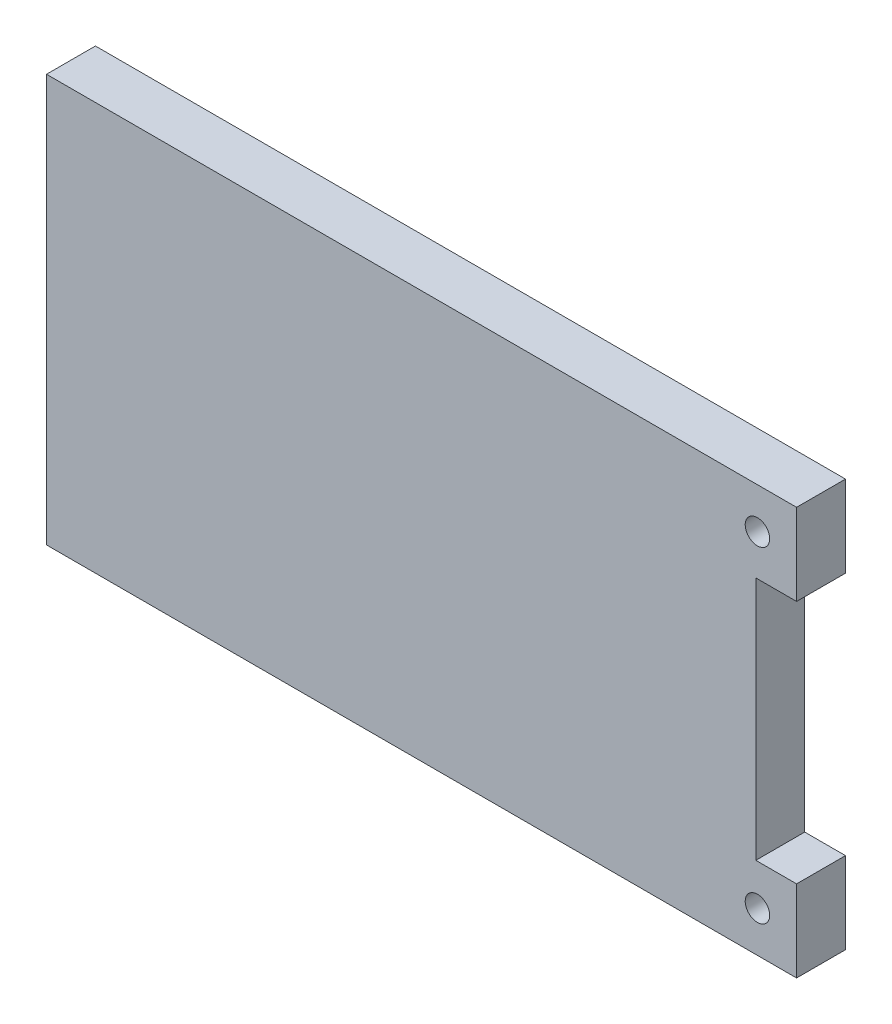
ISO-10303-21;
HEADER;
FILE_DESCRIPTION(('STEP AP214'),'2;1');
FILE_NAME('part.step','',(''),(''),'','','');
FILE_SCHEMA(('AUTOMOTIVE_DESIGN { 1 0 10303 214 1 1 1 1 }'));
ENDSEC;
DATA;
#1=APPLICATION_CONTEXT('core data for automotive mechanical design processes');
#2=APPLICATION_PROTOCOL_DEFINITION('international standard','automotive_design',2000,#1);
#3=PRODUCT_CONTEXT('',#1,'mechanical');
#4=PRODUCT('Part','Part','',(#3));
#5=PRODUCT_RELATED_PRODUCT_CATEGORY('part','',(#4));
#6=PRODUCT_DEFINITION_FORMATION('','',#4);
#7=PRODUCT_DEFINITION_CONTEXT('part definition',#1,'design');
#8=PRODUCT_DEFINITION('design','',#6,#7);
#9=PRODUCT_DEFINITION_SHAPE('','',#8);
#10=(LENGTH_UNIT() NAMED_UNIT(*) SI_UNIT(.MILLI.,.METRE.));
#11=(NAMED_UNIT(*) PLANE_ANGLE_UNIT() SI_UNIT($,.RADIAN.));
#12=(NAMED_UNIT(*) SI_UNIT($,.STERADIAN.) SOLID_ANGLE_UNIT());
#13=UNCERTAINTY_MEASURE_WITH_UNIT(LENGTH_MEASURE(1.E-05),#10,'distance_accuracy_value','');
#14=(GEOMETRIC_REPRESENTATION_CONTEXT(3) GLOBAL_UNCERTAINTY_ASSIGNED_CONTEXT((#13)) GLOBAL_UNIT_ASSIGNED_CONTEXT((#10,
#11,#12)) REPRESENTATION_CONTEXT('',''));
#15=CARTESIAN_POINT('',(0.,0.,0.));
#16=DIRECTION('',(0.,0.,1.));
#17=DIRECTION('',(1.,0.,0.));
#18=AXIS2_PLACEMENT_3D('',#15,#16,#17);
#19=CARTESIAN_POINT('',(0.,0.,0.6));
#20=DIRECTION('',(0.,0.,-1.));
#21=DIRECTION('',(-1.,0.,0.));
#22=AXIS2_PLACEMENT_3D('',#19,#20,#21);
#23=PLANE('',#22);
#24=DIRECTION('',(-1.,0.,0.));
#25=VECTOR('',#24,1.);
#26=CARTESIAN_POINT('',(139.15,52.1,0.6));
#27=LINE('',#26,#25);
#28=CARTESIAN_POINT('',(148.35,52.1,0.6));
#29=VERTEX_POINT('',#28);
#30=CARTESIAN_POINT('',(139.15,52.1,0.6));
#31=VERTEX_POINT('',#30);
#32=EDGE_CURVE('E148',#29,#31,#27,.T.);
#33=ORIENTED_EDGE('',*,*,#32,.T.);
#34=DIRECTION('',(0.,-1.,0.));
#35=VECTOR('',#34,1.);
#36=CARTESIAN_POINT('',(139.15,49.3,0.6));
#37=LINE('',#36,#35);
#38=CARTESIAN_POINT('',(139.15,47.1,0.6));
#39=VERTEX_POINT('',#38);
#40=EDGE_CURVE('E95',#31,#39,#37,.T.);
#41=ORIENTED_EDGE('',*,*,#40,.T.);
#42=DIRECTION('',(1.,0.,0.));
#43=VECTOR('',#42,1.);
#44=CARTESIAN_POINT('',(139.15,47.1,0.6));
#45=LINE('',#44,#43);
#46=CARTESIAN_POINT('',(148.35,47.1,0.6));
#47=VERTEX_POINT('',#46);
#48=EDGE_CURVE('E162',#39,#47,#45,.T.);
#49=ORIENTED_EDGE('',*,*,#48,.T.);
#50=DIRECTION('',(0.,1.,0.));
#51=VECTOR('',#50,1.);
#52=CARTESIAN_POINT('',(148.35,48.1,0.6));
#53=LINE('',#52,#51);
#54=CARTESIAN_POINT('',(148.35,48.1,0.6));
#55=VERTEX_POINT('',#54);
#56=EDGE_CURVE('E177',#47,#55,#53,.T.);
#57=ORIENTED_EDGE('',*,*,#56,.T.);
#58=DIRECTION('',(-1.,0.,0.));
#59=VECTOR('',#58,1.);
#60=CARTESIAN_POINT('',(147.85,48.1,0.6));
#61=LINE('',#60,#59);
#62=CARTESIAN_POINT('',(147.85,48.1,0.6));
#63=VERTEX_POINT('',#62);
#64=EDGE_CURVE('E114',#55,#63,#61,.T.);
#65=ORIENTED_EDGE('',*,*,#64,.T.);
#66=DIRECTION('',(0.,1.,0.));
#67=VECTOR('',#66,1.);
#68=CARTESIAN_POINT('',(147.85,51.1,0.6));
#69=LINE('',#68,#67);
#70=CARTESIAN_POINT('',(147.85,51.1,0.6));
#71=VERTEX_POINT('',#70);
#72=EDGE_CURVE('E108',#63,#71,#69,.T.);
#73=ORIENTED_EDGE('',*,*,#72,.T.);
#74=DIRECTION('',(1.,0.,0.));
#75=VECTOR('',#74,1.);
#76=CARTESIAN_POINT('',(148.35,51.1,0.6));
#77=LINE('',#76,#75);
#78=CARTESIAN_POINT('',(148.35,51.1,0.6));
#79=VERTEX_POINT('',#78);
#80=EDGE_CURVE('E112',#71,#79,#77,.T.);
#81=ORIENTED_EDGE('',*,*,#80,.T.);
#82=DIRECTION('',(0.,1.,0.));
#83=VECTOR('',#82,1.);
#84=CARTESIAN_POINT('',(148.35,52.1,0.6));
#85=LINE('',#84,#83);
#86=EDGE_CURVE('E52',#79,#29,#85,.T.);
#87=ORIENTED_EDGE('',*,*,#86,.T.);
#88=EDGE_LOOP('',(#33,#41,#49,#57,#65,#73,#81,#87));
#89=FACE_BOUND('',#88,.T.);
#90=CARTESIAN_POINT('',(147.87,47.6,0.6));
#91=DIRECTION('',(0.,0.,1.));
#92=DIRECTION('',(1.,0.,0.));
#93=AXIS2_PLACEMENT_3D('',#90,#91,#92);
#94=CIRCLE('',#93,0.15000000000002);
#95=CARTESIAN_POINT('',(148.02,47.6,0.6));
#96=VERTEX_POINT('',#95);
#97=EDGE_CURVE('E136',#96,#96,#94,.T.);
#98=ORIENTED_EDGE('',*,*,#97,.F.);
#99=EDGE_LOOP('',(#98));
#100=FACE_BOUND('',#99,.T.);
#101=CARTESIAN_POINT('',(147.87,51.6,0.6));
#102=DIRECTION('',(0.,0.,1.));
#103=DIRECTION('',(1.,0.,0.));
#104=AXIS2_PLACEMENT_3D('',#101,#102,#103);
#105=CIRCLE('',#104,0.15000000000002);
#106=CARTESIAN_POINT('',(148.02,51.6,0.6));
#107=VERTEX_POINT('',#106);
#108=EDGE_CURVE('E186',#107,#107,#105,.T.);
#109=ORIENTED_EDGE('',*,*,#108,.F.);
#110=EDGE_LOOP('',(#109));
#111=FACE_BOUND('',#110,.T.);
#112=ADVANCED_FACE('F35',(#89,#100,#111),#23,.F.);
#113=CARTESIAN_POINT('',(0.,0.,0.));
#114=DIRECTION('',(0.,0.,-1.));
#115=DIRECTION('',(-1.,0.,0.));
#116=AXIS2_PLACEMENT_3D('',#113,#114,#115);
#117=PLANE('',#116);
#118=CARTESIAN_POINT('',(147.87,47.6,0.));
#119=DIRECTION('',(0.,0.,1.));
#120=DIRECTION('',(1.,0.,0.));
#121=AXIS2_PLACEMENT_3D('',#118,#119,#120);
#122=CIRCLE('',#121,0.15000000000002);
#123=CARTESIAN_POINT('',(148.02,47.6,0.));
#124=VERTEX_POINT('',#123);
#125=EDGE_CURVE('E183',#124,#124,#122,.T.);
#126=ORIENTED_EDGE('',*,*,#125,.T.);
#127=EDGE_LOOP('',(#126));
#128=FACE_BOUND('',#127,.T.);
#129=DIRECTION('',(-1.,0.,0.));
#130=VECTOR('',#129,1.);
#131=CARTESIAN_POINT('',(139.15,52.1,0.));
#132=LINE('',#131,#130);
#133=CARTESIAN_POINT('',(148.35,52.1,0.));
#134=VERTEX_POINT('',#133);
#135=CARTESIAN_POINT('',(139.15,52.1,0.));
#136=VERTEX_POINT('',#135);
#137=EDGE_CURVE('E132',#134,#136,#132,.T.);
#138=ORIENTED_EDGE('',*,*,#137,.F.);
#139=DIRECTION('',(0.,1.,0.));
#140=VECTOR('',#139,1.);
#141=CARTESIAN_POINT('',(148.35,52.1,0.));
#142=LINE('',#141,#140);
#143=CARTESIAN_POINT('',(148.35,51.1,0.));
#144=VERTEX_POINT('',#143);
#145=EDGE_CURVE('E87',#144,#134,#142,.T.);
#146=ORIENTED_EDGE('',*,*,#145,.F.);
#147=DIRECTION('',(1.,0.,0.));
#148=VECTOR('',#147,1.);
#149=CARTESIAN_POINT('',(148.35,51.1,0.));
#150=LINE('',#149,#148);
#151=CARTESIAN_POINT('',(147.85,51.1,0.));
#152=VERTEX_POINT('',#151);
#153=EDGE_CURVE('E81',#152,#144,#150,.T.);
#154=ORIENTED_EDGE('',*,*,#153,.F.);
#155=DIRECTION('',(0.,1.,0.));
#156=VECTOR('',#155,1.);
#157=CARTESIAN_POINT('',(147.85,51.1,0.));
#158=LINE('',#157,#156);
#159=CARTESIAN_POINT('',(147.85,48.1,0.));
#160=VERTEX_POINT('',#159);
#161=EDGE_CURVE('E122',#160,#152,#158,.T.);
#162=ORIENTED_EDGE('',*,*,#161,.F.);
#163=DIRECTION('',(-1.,0.,0.));
#164=VECTOR('',#163,1.);
#165=CARTESIAN_POINT('',(147.85,48.1,0.));
#166=LINE('',#165,#164);
#167=CARTESIAN_POINT('',(148.35,48.1,0.));
#168=VERTEX_POINT('',#167);
#169=EDGE_CURVE('E143',#168,#160,#166,.T.);
#170=ORIENTED_EDGE('',*,*,#169,.F.);
#171=DIRECTION('',(0.,1.,0.));
#172=VECTOR('',#171,1.);
#173=CARTESIAN_POINT('',(148.35,48.1,0.));
#174=LINE('',#173,#172);
#175=CARTESIAN_POINT('',(148.35,47.1,0.));
#176=VERTEX_POINT('',#175);
#177=EDGE_CURVE('E141',#176,#168,#174,.T.);
#178=ORIENTED_EDGE('',*,*,#177,.F.);
#179=DIRECTION('',(1.,0.,0.));
#180=VECTOR('',#179,1.);
#181=CARTESIAN_POINT('',(148.35,47.1,0.));
#182=LINE('',#181,#180);
#183=CARTESIAN_POINT('',(139.15,47.1,0.));
#184=VERTEX_POINT('',#183);
#185=EDGE_CURVE('E139',#184,#176,#182,.T.);
#186=ORIENTED_EDGE('',*,*,#185,.F.);
#187=DIRECTION('',(0.,-1.,0.));
#188=VECTOR('',#187,1.);
#189=CARTESIAN_POINT('',(139.15,48.3,0.));
#190=LINE('',#189,#188);
#191=EDGE_CURVE('E135',#136,#184,#190,.T.);
#192=ORIENTED_EDGE('',*,*,#191,.F.);
#193=EDGE_LOOP('',(#138,#146,#154,#162,#170,#178,#186,#192));
#194=FACE_BOUND('',#193,.T.);
#195=CARTESIAN_POINT('',(147.87,51.6,0.));
#196=DIRECTION('',(0.,0.,1.));
#197=DIRECTION('',(1.,0.,0.));
#198=AXIS2_PLACEMENT_3D('',#195,#196,#197);
#199=CIRCLE('',#198,0.15000000000002);
#200=CARTESIAN_POINT('',(148.02,51.6,0.));
#201=VERTEX_POINT('',#200);
#202=EDGE_CURVE('E189',#201,#201,#199,.T.);
#203=ORIENTED_EDGE('',*,*,#202,.T.);
#204=EDGE_LOOP('',(#203));
#205=FACE_BOUND('',#204,.T.);
#206=ADVANCED_FACE('F167',(#128,#194,#205),#117,.T.);
#207=CARTESIAN_POINT('',(139.15,52.1,0.6));
#208=DIRECTION('',(0.,-1.,0.));
#209=DIRECTION('',(0.,0.,-1.));
#210=AXIS2_PLACEMENT_3D('',#207,#208,#209);
#211=PLANE('',#210);
#212=ORIENTED_EDGE('',*,*,#137,.T.);
#213=DIRECTION('',(0.,0.,-1.));
#214=VECTOR('',#213,1.);
#215=CARTESIAN_POINT('',(139.15,52.1,0.6));
#216=LINE('',#215,#214);
#217=EDGE_CURVE('E11',#31,#136,#216,.T.);
#218=ORIENTED_EDGE('',*,*,#217,.F.);
#219=ORIENTED_EDGE('',*,*,#32,.F.);
#220=DIRECTION('',(0.,0.,-1.));
#221=VECTOR('',#220,1.);
#222=CARTESIAN_POINT('',(148.35,52.1,0.6));
#223=LINE('',#222,#221);
#224=EDGE_CURVE('E128',#29,#134,#223,.T.);
#225=ORIENTED_EDGE('',*,*,#224,.T.);
#226=EDGE_LOOP('',(#212,#218,#219,#225));
#227=FACE_BOUND('',#226,.T.);
#228=ADVANCED_FACE('F37',(#227),#211,.F.);
#229=CARTESIAN_POINT('',(139.15,48.3,0.6));
#230=DIRECTION('',(1.,0.,0.));
#231=DIRECTION('',(0.,0.,-1.));
#232=AXIS2_PLACEMENT_3D('',#229,#230,#231);
#233=PLANE('',#232);
#234=ORIENTED_EDGE('',*,*,#191,.T.);
#235=DIRECTION('',(0.,0.,-1.));
#236=VECTOR('',#235,1.);
#237=CARTESIAN_POINT('',(139.15,47.1,0.6));
#238=LINE('',#237,#236);
#239=EDGE_CURVE('E44',#39,#184,#238,.T.);
#240=ORIENTED_EDGE('',*,*,#239,.F.);
#241=ORIENTED_EDGE('',*,*,#40,.F.);
#242=ORIENTED_EDGE('',*,*,#217,.T.);
#243=EDGE_LOOP('',(#234,#240,#241,#242));
#244=FACE_BOUND('',#243,.T.);
#245=ADVANCED_FACE('F163',(#244),#233,.F.);
#246=CARTESIAN_POINT('',(148.35,47.1,0.6));
#247=DIRECTION('',(0.,1.,0.));
#248=DIRECTION('',(0.,0.,1.));
#249=AXIS2_PLACEMENT_3D('',#246,#247,#248);
#250=PLANE('',#249);
#251=ORIENTED_EDGE('',*,*,#185,.T.);
#252=DIRECTION('',(0.,0.,-1.));
#253=VECTOR('',#252,1.);
#254=CARTESIAN_POINT('',(148.35,47.1,0.6));
#255=LINE('',#254,#253);
#256=EDGE_CURVE('E155',#47,#176,#255,.T.);
#257=ORIENTED_EDGE('',*,*,#256,.F.);
#258=ORIENTED_EDGE('',*,*,#48,.F.);
#259=ORIENTED_EDGE('',*,*,#239,.T.);
#260=EDGE_LOOP('',(#251,#257,#258,#259));
#261=FACE_BOUND('',#260,.T.);
#262=ADVANCED_FACE('F160',(#261),#250,.F.);
#263=CARTESIAN_POINT('',(148.35,48.1,0.6));
#264=DIRECTION('',(-1.,0.,0.));
#265=DIRECTION('',(0.,0.,1.));
#266=AXIS2_PLACEMENT_3D('',#263,#264,#265);
#267=PLANE('',#266);
#268=ORIENTED_EDGE('',*,*,#177,.T.);
#269=DIRECTION('',(0.,0.,-1.));
#270=VECTOR('',#269,1.);
#271=CARTESIAN_POINT('',(148.35,48.1,0.6));
#272=LINE('',#271,#270);
#273=EDGE_CURVE('E152',#55,#168,#272,.T.);
#274=ORIENTED_EDGE('',*,*,#273,.F.);
#275=ORIENTED_EDGE('',*,*,#56,.F.);
#276=ORIENTED_EDGE('',*,*,#256,.T.);
#277=EDGE_LOOP('',(#268,#274,#275,#276));
#278=FACE_BOUND('',#277,.T.);
#279=ADVANCED_FACE('F173',(#278),#267,.F.);
#280=CARTESIAN_POINT('',(147.85,48.1,0.6));
#281=DIRECTION('',(0.,-1.,0.));
#282=DIRECTION('',(0.,0.,-1.));
#283=AXIS2_PLACEMENT_3D('',#280,#281,#282);
#284=PLANE('',#283);
#285=ORIENTED_EDGE('',*,*,#169,.T.);
#286=DIRECTION('',(0.,0.,-1.));
#287=VECTOR('',#286,1.);
#288=CARTESIAN_POINT('',(147.85,48.1,0.6));
#289=LINE('',#288,#287);
#290=EDGE_CURVE('E123',#63,#160,#289,.T.);
#291=ORIENTED_EDGE('',*,*,#290,.F.);
#292=ORIENTED_EDGE('',*,*,#64,.F.);
#293=ORIENTED_EDGE('',*,*,#273,.T.);
#294=EDGE_LOOP('',(#285,#291,#292,#293));
#295=FACE_BOUND('',#294,.T.);
#296=ADVANCED_FACE('F176',(#295),#284,.F.);
#297=CARTESIAN_POINT('',(147.85,51.1,0.6));
#298=DIRECTION('',(-1.,0.,0.));
#299=DIRECTION('',(0.,0.,1.));
#300=AXIS2_PLACEMENT_3D('',#297,#298,#299);
#301=PLANE('',#300);
#302=ORIENTED_EDGE('',*,*,#161,.T.);
#303=DIRECTION('',(0.,0.,-1.));
#304=VECTOR('',#303,1.);
#305=CARTESIAN_POINT('',(147.85,51.1,0.6));
#306=LINE('',#305,#304);
#307=EDGE_CURVE('E119',#71,#152,#306,.T.);
#308=ORIENTED_EDGE('',*,*,#307,.F.);
#309=ORIENTED_EDGE('',*,*,#72,.F.);
#310=ORIENTED_EDGE('',*,*,#290,.T.);
#311=EDGE_LOOP('',(#302,#308,#309,#310));
#312=FACE_BOUND('',#311,.T.);
#313=ADVANCED_FACE('F120',(#312),#301,.F.);
#314=CARTESIAN_POINT('',(148.35,51.1,0.6));
#315=DIRECTION('',(0.,1.,0.));
#316=DIRECTION('',(0.,0.,1.));
#317=AXIS2_PLACEMENT_3D('',#314,#315,#316);
#318=PLANE('',#317);
#319=ORIENTED_EDGE('',*,*,#153,.T.);
#320=DIRECTION('',(0.,0.,-1.));
#321=VECTOR('',#320,1.);
#322=CARTESIAN_POINT('',(148.35,51.1,0.6));
#323=LINE('',#322,#321);
#324=EDGE_CURVE('E124',#79,#144,#323,.T.);
#325=ORIENTED_EDGE('',*,*,#324,.F.);
#326=ORIENTED_EDGE('',*,*,#80,.F.);
#327=ORIENTED_EDGE('',*,*,#307,.T.);
#328=EDGE_LOOP('',(#319,#325,#326,#327));
#329=FACE_BOUND('',#328,.T.);
#330=ADVANCED_FACE('F126',(#329),#318,.F.);
#331=CARTESIAN_POINT('',(148.35,52.1,0.6));
#332=DIRECTION('',(-1.,0.,0.));
#333=DIRECTION('',(0.,0.,1.));
#334=AXIS2_PLACEMENT_3D('',#331,#332,#333);
#335=PLANE('',#334);
#336=ORIENTED_EDGE('',*,*,#145,.T.);
#337=ORIENTED_EDGE('',*,*,#224,.F.);
#338=ORIENTED_EDGE('',*,*,#86,.F.);
#339=ORIENTED_EDGE('',*,*,#324,.T.);
#340=EDGE_LOOP('',(#336,#337,#338,#339));
#341=FACE_BOUND('',#340,.T.);
#342=ADVANCED_FACE('F209',(#341),#335,.F.);
#343=CARTESIAN_POINT('',(147.87,47.6,0.6));
#344=DIRECTION('',(0.,0.,-1.));
#345=DIRECTION('',(-1.,0.,0.));
#346=AXIS2_PLACEMENT_3D('',#343,#344,#345);
#347=CYLINDRICAL_SURFACE('',#346,0.15000000000002);
#348=ORIENTED_EDGE('',*,*,#97,.T.);
#349=EDGE_LOOP('',(#348));
#350=FACE_BOUND('',#349,.T.);
#351=ORIENTED_EDGE('',*,*,#125,.F.);
#352=EDGE_LOOP('',(#351));
#353=FACE_BOUND('',#352,.T.);
#354=ADVANCED_FACE('F206',(#350,#353),#347,.F.);
#355=CARTESIAN_POINT('',(147.87,51.6,0.6));
#356=DIRECTION('',(0.,0.,-1.));
#357=DIRECTION('',(-1.,0.,0.));
#358=AXIS2_PLACEMENT_3D('',#355,#356,#357);
#359=CYLINDRICAL_SURFACE('',#358,0.15000000000002);
#360=ORIENTED_EDGE('',*,*,#108,.T.);
#361=EDGE_LOOP('',(#360));
#362=FACE_BOUND('',#361,.T.);
#363=ORIENTED_EDGE('',*,*,#202,.F.);
#364=EDGE_LOOP('',(#363));
#365=FACE_BOUND('',#364,.T.);
#366=ADVANCED_FACE('F195',(#362,#365),#359,.F.);
#367=CLOSED_SHELL('',(#112,#206,#228,#245,#262,#279,#296,#313,#330,#342,#354,#366));
#368=MANIFOLD_SOLID_BREP('B2',#367);
#369=ADVANCED_BREP_SHAPE_REPRESENTATION('',(#18,#368),#14);
#370=SHAPE_DEFINITION_REPRESENTATION(#9,#369);
ENDSEC;
END-ISO-10303-21;
